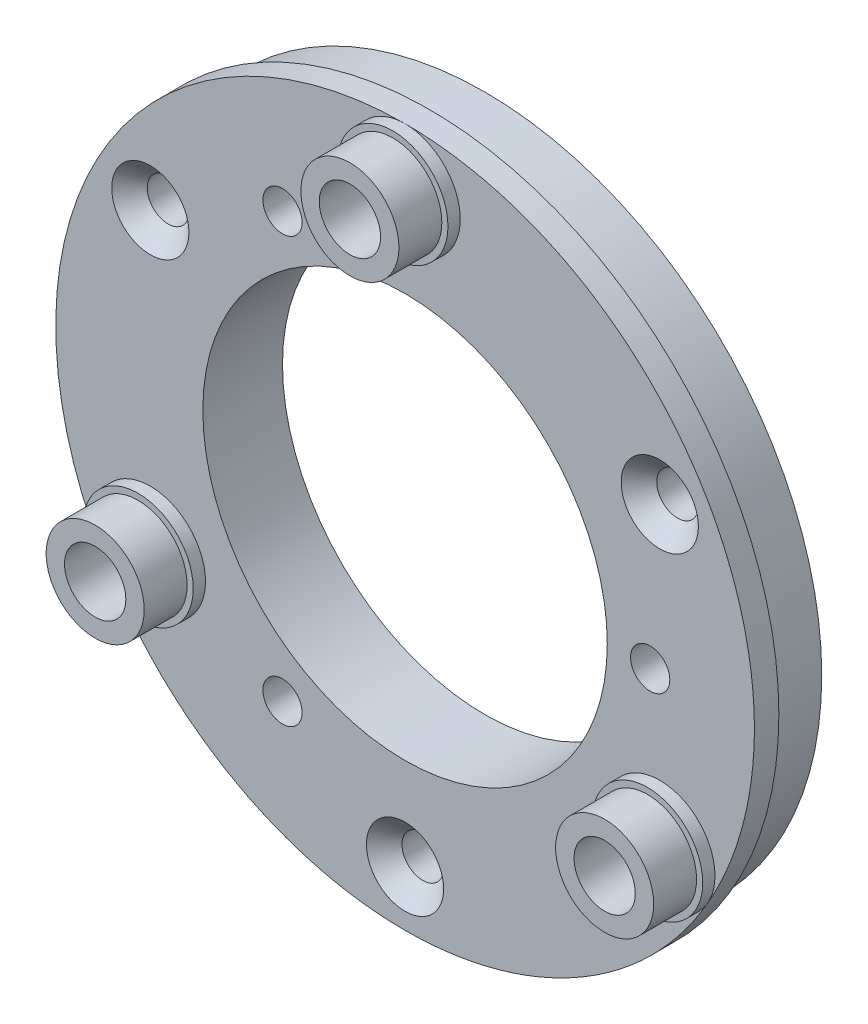
ISO-10303-21;
HEADER;
FILE_DESCRIPTION(('STEP AP214'),'2;1');
FILE_NAME('part.step','',(''),(''),'','','');
FILE_SCHEMA(('AUTOMOTIVE_DESIGN { 1 0 10303 214 1 1 1 1 }'));
ENDSEC;
DATA;
#1=APPLICATION_CONTEXT('core data for automotive mechanical design processes');
#2=APPLICATION_PROTOCOL_DEFINITION('international standard','automotive_design',2000,#1);
#3=PRODUCT_CONTEXT('',#1,'mechanical');
#4=PRODUCT('Part','Part','',(#3));
#5=PRODUCT_RELATED_PRODUCT_CATEGORY('part','',(#4));
#6=PRODUCT_DEFINITION_FORMATION('','',#4);
#7=PRODUCT_DEFINITION_CONTEXT('part definition',#1,'design');
#8=PRODUCT_DEFINITION('design','',#6,#7);
#9=PRODUCT_DEFINITION_SHAPE('','',#8);
#10=(LENGTH_UNIT() NAMED_UNIT(*) SI_UNIT(.MILLI.,.METRE.));
#11=(NAMED_UNIT(*) PLANE_ANGLE_UNIT() SI_UNIT($,.RADIAN.));
#12=(NAMED_UNIT(*) SI_UNIT($,.STERADIAN.) SOLID_ANGLE_UNIT());
#13=UNCERTAINTY_MEASURE_WITH_UNIT(LENGTH_MEASURE(1.E-05),#10,'distance_accuracy_value','');
#14=(GEOMETRIC_REPRESENTATION_CONTEXT(3) GLOBAL_UNCERTAINTY_ASSIGNED_CONTEXT((#13)) GLOBAL_UNIT_ASSIGNED_CONTEXT((#10,
#11,#12)) REPRESENTATION_CONTEXT('',''));
#15=CARTESIAN_POINT('',(0.,0.,0.));
#16=DIRECTION('',(0.,0.,1.));
#17=DIRECTION('',(1.,0.,0.));
#18=AXIS2_PLACEMENT_3D('',#15,#16,#17);
#19=CARTESIAN_POINT('',(0.,0.,-4.5));
#20=DIRECTION('',(0.,0.,-1.));
#21=DIRECTION('',(-1.,0.,0.));
#22=AXIS2_PLACEMENT_3D('',#19,#20,#21);
#23=PLANE('',#22);
#24=CARTESIAN_POINT('',(-1.75207071073658E-13,-24.,-4.5));
#25=DIRECTION('',(0.,0.,1.));
#26=DIRECTION('',(1.,0.,0.));
#27=AXIS2_PLACEMENT_3D('',#24,#25,#26);
#28=CIRCLE('',#27,1.7);
#29=CARTESIAN_POINT('',(1.69999999999982,-24.,-4.5));
#30=VERTEX_POINT('',#29);
#31=EDGE_CURVE('E575',#30,#30,#28,.T.);
#32=ORIENTED_EDGE('',*,*,#31,.T.);
#33=EDGE_LOOP('',(#32));
#34=FACE_BOUND('',#33,.T.);
#35=CARTESIAN_POINT('',(20.,-2.18575157973078E-13,-4.5));
#36=DIRECTION('',(0.,0.,-1.));
#37=DIRECTION('',(0.500000000000004,0.866025403784436,0.));
#38=AXIS2_PLACEMENT_3D('',#35,#36,#37);
#39=CIRCLE('',#38,1.6);
#40=CARTESIAN_POINT('',(20.8,1.38564064605488,-4.5));
#41=VERTEX_POINT('',#40);
#42=EDGE_CURVE('E578',#41,#41,#39,.T.);
#43=ORIENTED_EDGE('',*,*,#42,.F.);
#44=EDGE_LOOP('',(#43));
#45=FACE_BOUND('',#44,.T.);
#46=CARTESIAN_POINT('',(-10.0000000000003,-17.3205080756886,-4.5));
#47=DIRECTION('',(0.,0.,-1.));
#48=DIRECTION('',(0.499999999999992,-0.866025403784443,0.));
#49=AXIS2_PLACEMENT_3D('',#46,#47,#48);
#50=CIRCLE('',#49,1.6);
#51=CARTESIAN_POINT('',(-9.20000000000028,-18.7061487217437,-4.5));
#52=VERTEX_POINT('',#51);
#53=EDGE_CURVE('E577',#52,#52,#50,.T.);
#54=ORIENTED_EDGE('',*,*,#53,.F.);
#55=EDGE_LOOP('',(#54));
#56=FACE_BOUND('',#55,.T.);
#57=CARTESIAN_POINT('',(-9.99999999999989,17.3205080756888,-4.5));
#58=DIRECTION('',(0.,0.,-1.));
#59=DIRECTION('',(-1.,0.,0.));
#60=AXIS2_PLACEMENT_3D('',#57,#58,#59);
#61=CIRCLE('',#60,1.6);
#62=CARTESIAN_POINT('',(-11.5999999999999,17.3205080756888,-4.5));
#63=VERTEX_POINT('',#62);
#64=EDGE_CURVE('E589',#63,#63,#61,.T.);
#65=ORIENTED_EDGE('',*,*,#64,.F.);
#66=EDGE_LOOP('',(#65));
#67=FACE_BOUND('',#66,.T.);
#68=CARTESIAN_POINT('',(-20.7846096908265,-12.0000000000001,-4.5));
#69=DIRECTION('',(0.,0.,1.));
#70=DIRECTION('',(-0.500000000000004,0.866025403784436,0.));
#71=AXIS2_PLACEMENT_3D('',#68,#69,#70);
#72=CIRCLE('',#71,1.5);
#73=CARTESIAN_POINT('',(-21.5346096908265,-10.7009618943234,-4.5));
#74=VERTEX_POINT('',#73);
#75=EDGE_CURVE('E112',#74,#74,#72,.T.);
#76=ORIENTED_EDGE('',*,*,#75,.T.);
#77=EDGE_LOOP('',(#76));
#78=FACE_BOUND('',#77,.T.);
#79=CARTESIAN_POINT('',(20.7846096908266,-11.9999999999998,-4.5));
#80=DIRECTION('',(0.,0.,1.));
#81=DIRECTION('',(-0.499999999999992,-0.866025403784443,0.));
#82=AXIS2_PLACEMENT_3D('',#79,#80,#81);
#83=CIRCLE('',#82,1.5);
#84=CARTESIAN_POINT('',(20.0346096908267,-13.2990381056765,-4.5));
#85=VERTEX_POINT('',#84);
#86=EDGE_CURVE('E91',#85,#85,#83,.T.);
#87=ORIENTED_EDGE('',*,*,#86,.T.);
#88=EDGE_LOOP('',(#87));
#89=FACE_BOUND('',#88,.T.);
#90=CARTESIAN_POINT('',(0.,24.,-4.5));
#91=DIRECTION('',(0.,0.,1.));
#92=DIRECTION('',(1.,0.,0.));
#93=AXIS2_PLACEMENT_3D('',#90,#91,#92);
#94=CIRCLE('',#93,1.5);
#95=CARTESIAN_POINT('',(1.5,24.,-4.5));
#96=VERTEX_POINT('',#95);
#97=EDGE_CURVE('E115',#96,#96,#94,.T.);
#98=ORIENTED_EDGE('',*,*,#97,.T.);
#99=EDGE_LOOP('',(#98));
#100=FACE_BOUND('',#99,.T.);
#101=CARTESIAN_POINT('',(0.,0.,-4.5));
#102=DIRECTION('',(0.,0.,-1.));
#103=DIRECTION('',(-1.,0.,0.));
#104=AXIS2_PLACEMENT_3D('',#101,#102,#103);
#105=CIRCLE('',#104,27.5);
#106=CARTESIAN_POINT('',(-27.5,0.,-4.5));
#107=VERTEX_POINT('',#106);
#108=EDGE_CURVE('E81',#107,#107,#105,.T.);
#109=ORIENTED_EDGE('',*,*,#108,.T.);
#110=EDGE_LOOP('',(#109));
#111=FACE_BOUND('',#110,.T.);
#112=CARTESIAN_POINT('',(0.,0.,-4.5));
#113=DIRECTION('',(0.,0.,-1.));
#114=DIRECTION('',(-1.,0.,0.));
#115=AXIS2_PLACEMENT_3D('',#112,#113,#114);
#116=CIRCLE('',#115,16.5);
#117=CARTESIAN_POINT('',(-16.5,0.,-4.5));
#118=VERTEX_POINT('',#117);
#119=EDGE_CURVE('E594',#118,#118,#116,.T.);
#120=ORIENTED_EDGE('',*,*,#119,.F.);
#121=EDGE_LOOP('',(#120));
#122=FACE_BOUND('',#121,.T.);
#123=CARTESIAN_POINT('',(20.7846096908266,11.9999999999999,-4.5));
#124=DIRECTION('',(0.,0.,1.));
#125=DIRECTION('',(1.,0.,0.));
#126=AXIS2_PLACEMENT_3D('',#123,#124,#125);
#127=CIRCLE('',#126,1.7);
#128=CARTESIAN_POINT('',(22.4846096908266,11.9999999999999,-4.5));
#129=VERTEX_POINT('',#128);
#130=EDGE_CURVE('E566',#129,#129,#127,.T.);
#131=ORIENTED_EDGE('',*,*,#130,.T.);
#132=EDGE_LOOP('',(#131));
#133=FACE_BOUND('',#132,.T.);
#134=CARTESIAN_POINT('',(-20.7846096908264,12.0000000000003,-4.5));
#135=DIRECTION('',(0.,0.,1.));
#136=DIRECTION('',(1.,0.,0.));
#137=AXIS2_PLACEMENT_3D('',#134,#135,#136);
#138=CIRCLE('',#137,1.7);
#139=CARTESIAN_POINT('',(-19.0846096908264,12.0000000000003,-4.5));
#140=VERTEX_POINT('',#139);
#141=EDGE_CURVE('E555',#140,#140,#138,.T.);
#142=ORIENTED_EDGE('',*,*,#141,.T.);
#143=EDGE_LOOP('',(#142));
#144=FACE_BOUND('',#143,.T.);
#145=ADVANCED_FACE('F36',(#34,#45,#56,#67,#78,#89,#100,#111,#122,#133,#144),#23,.T.);
#146=CARTESIAN_POINT('',(-20.7846096908265,-12.0000000000001,0.));
#147=DIRECTION('',(0.,0.,1.));
#148=DIRECTION('',(1.,0.,0.));
#149=AXIS2_PLACEMENT_3D('',#146,#147,#148);
#150=CYLINDRICAL_SURFACE('',#149,1.5);
#151=ORIENTED_EDGE('',*,*,#75,.F.);
#152=EDGE_LOOP('',(#151));
#153=FACE_BOUND('',#152,.T.);
#154=CARTESIAN_POINT('',(-20.7846096908265,-12.0000000000001,-1.5));
#155=DIRECTION('',(0.,0.,1.));
#156=DIRECTION('',(1.,0.,0.));
#157=AXIS2_PLACEMENT_3D('',#154,#155,#156);
#158=CIRCLE('',#157,1.5);
#159=CARTESIAN_POINT('',(-19.2846096908265,-12.0000000000001,-1.5));
#160=VERTEX_POINT('',#159);
#161=EDGE_CURVE('E40',#160,#160,#158,.F.);
#162=ORIENTED_EDGE('',*,*,#161,.F.);
#163=EDGE_LOOP('',(#162));
#164=FACE_BOUND('',#163,.T.);
#165=ADVANCED_FACE('F169',(#153,#164),#150,.F.);
#166=CARTESIAN_POINT('',(20.7846096908266,-11.9999999999998,0.));
#167=DIRECTION('',(0.,0.,1.));
#168=DIRECTION('',(1.,0.,0.));
#169=AXIS2_PLACEMENT_3D('',#166,#167,#168);
#170=CYLINDRICAL_SURFACE('',#169,1.5);
#171=ORIENTED_EDGE('',*,*,#86,.F.);
#172=EDGE_LOOP('',(#171));
#173=FACE_BOUND('',#172,.T.);
#174=CARTESIAN_POINT('',(20.7846096908266,-11.9999999999998,-1.5));
#175=DIRECTION('',(0.,0.,1.));
#176=DIRECTION('',(1.,0.,0.));
#177=AXIS2_PLACEMENT_3D('',#174,#175,#176);
#178=CIRCLE('',#177,1.5);
#179=CARTESIAN_POINT('',(22.2846096908266,-11.9999999999998,-1.5));
#180=VERTEX_POINT('',#179);
#181=EDGE_CURVE('E93',#180,#180,#178,.F.);
#182=ORIENTED_EDGE('',*,*,#181,.F.);
#183=EDGE_LOOP('',(#182));
#184=FACE_BOUND('',#183,.T.);
#185=ADVANCED_FACE('F174',(#173,#184),#170,.F.);
#186=CARTESIAN_POINT('',(0.,24.,0.));
#187=DIRECTION('',(0.,0.,1.));
#188=DIRECTION('',(1.,0.,0.));
#189=AXIS2_PLACEMENT_3D('',#186,#187,#188);
#190=CYLINDRICAL_SURFACE('',#189,1.5);
#191=ORIENTED_EDGE('',*,*,#97,.F.);
#192=EDGE_LOOP('',(#191));
#193=FACE_BOUND('',#192,.T.);
#194=CARTESIAN_POINT('',(0.,24.,-1.5));
#195=DIRECTION('',(0.,0.,1.));
#196=DIRECTION('',(1.,0.,0.));
#197=AXIS2_PLACEMENT_3D('',#194,#195,#196);
#198=CIRCLE('',#197,1.5);
#199=CARTESIAN_POINT('',(1.5,24.,-1.5));
#200=VERTEX_POINT('',#199);
#201=EDGE_CURVE('E89',#200,#200,#198,.F.);
#202=ORIENTED_EDGE('',*,*,#201,.F.);
#203=EDGE_LOOP('',(#202));
#204=FACE_BOUND('',#203,.T.);
#205=ADVANCED_FACE('F185',(#193,#204),#190,.F.);
#206=CARTESIAN_POINT('',(0.,0.,2.));
#207=DIRECTION('',(0.,0.,1.));
#208=DIRECTION('',(1.,0.,0.));
#209=AXIS2_PLACEMENT_3D('',#206,#207,#208);
#210=PLANE('',#209);
#211=CARTESIAN_POINT('',(-20.7846096908264,12.0000000000003,2.));
#212=DIRECTION('',(0.,0.,1.));
#213=DIRECTION('',(1.,0.,0.));
#214=AXIS2_PLACEMENT_3D('',#211,#212,#213);
#215=CIRCLE('',#214,3.15);
#216=CARTESIAN_POINT('',(-17.6346096908264,12.0000000000003,2.));
#217=VERTEX_POINT('',#216);
#218=EDGE_CURVE('E553',#217,#217,#215,.T.);
#219=ORIENTED_EDGE('',*,*,#218,.F.);
#220=EDGE_LOOP('',(#219));
#221=FACE_BOUND('',#220,.T.);
#222=CARTESIAN_POINT('',(20.7846096908266,11.9999999999999,2.));
#223=DIRECTION('',(0.,0.,1.));
#224=DIRECTION('',(1.,0.,0.));
#225=AXIS2_PLACEMENT_3D('',#222,#223,#224);
#226=CIRCLE('',#225,3.15);
#227=CARTESIAN_POINT('',(23.9346096908266,11.9999999999999,2.));
#228=VERTEX_POINT('',#227);
#229=EDGE_CURVE('E560',#228,#228,#226,.T.);
#230=ORIENTED_EDGE('',*,*,#229,.F.);
#231=EDGE_LOOP('',(#230));
#232=FACE_BOUND('',#231,.T.);
#233=CARTESIAN_POINT('',(-1.75207071073658E-13,-24.,2.));
#234=DIRECTION('',(0.,0.,1.));
#235=DIRECTION('',(1.,0.,0.));
#236=AXIS2_PLACEMENT_3D('',#233,#234,#235);
#237=CIRCLE('',#236,3.15);
#238=CARTESIAN_POINT('',(3.14999999999982,-24.,2.));
#239=VERTEX_POINT('',#238);
#240=EDGE_CURVE('E569',#239,#239,#237,.T.);
#241=ORIENTED_EDGE('',*,*,#240,.F.);
#242=EDGE_LOOP('',(#241));
#243=FACE_BOUND('',#242,.T.);
#244=CARTESIAN_POINT('',(20.,-2.18575157973078E-13,2.));
#245=DIRECTION('',(0.,0.,1.));
#246=DIRECTION('',(1.,0.,0.));
#247=AXIS2_PLACEMENT_3D('',#244,#245,#246);
#248=CIRCLE('',#247,1.6);
#249=CARTESIAN_POINT('',(21.6,-2.18575157973078E-13,2.));
#250=VERTEX_POINT('',#249);
#251=EDGE_CURVE('E586',#250,#250,#248,.T.);
#252=ORIENTED_EDGE('',*,*,#251,.F.);
#253=EDGE_LOOP('',(#252));
#254=FACE_BOUND('',#253,.T.);
#255=CARTESIAN_POINT('',(-10.0000000000003,-17.3205080756886,2.));
#256=DIRECTION('',(0.,0.,1.));
#257=DIRECTION('',(1.,0.,0.));
#258=AXIS2_PLACEMENT_3D('',#255,#256,#257);
#259=CIRCLE('',#258,1.6);
#260=CARTESIAN_POINT('',(-8.40000000000027,-17.3205080756886,2.));
#261=VERTEX_POINT('',#260);
#262=EDGE_CURVE('E581',#261,#261,#259,.T.);
#263=ORIENTED_EDGE('',*,*,#262,.F.);
#264=EDGE_LOOP('',(#263));
#265=FACE_BOUND('',#264,.T.);
#266=CARTESIAN_POINT('',(-9.99999999999989,17.3205080756888,2.));
#267=DIRECTION('',(0.,0.,1.));
#268=DIRECTION('',(1.,0.,0.));
#269=AXIS2_PLACEMENT_3D('',#266,#267,#268);
#270=CIRCLE('',#269,1.6);
#271=CARTESIAN_POINT('',(-8.39999999999989,17.3205080756888,2.));
#272=VERTEX_POINT('',#271);
#273=EDGE_CURVE('E592',#272,#272,#270,.T.);
#274=ORIENTED_EDGE('',*,*,#273,.F.);
#275=EDGE_LOOP('',(#274));
#276=FACE_BOUND('',#275,.T.);
#277=CARTESIAN_POINT('',(0.,24.,2.));
#278=DIRECTION('',(0.,0.,1.));
#279=DIRECTION('',(1.,0.,0.));
#280=AXIS2_PLACEMENT_3D('',#277,#278,#279);
#281=CIRCLE('',#280,4.5);
#282=CARTESIAN_POINT('',(0.,28.5,2.));
#283=VERTEX_POINT('',#282);
#284=EDGE_CURVE('E63',#283,#283,#281,.T.);
#285=ORIENTED_EDGE('',*,*,#284,.F.);
#286=CARTESIAN_POINT('',(0.,0.,2.));
#287=DIRECTION('',(0.,0.,1.));
#288=DIRECTION('',(1.,0.,0.));
#289=AXIS2_PLACEMENT_3D('',#286,#287,#288);
#290=CIRCLE('',#289,28.5);
#291=CARTESIAN_POINT('',(-24.6817240078564,-14.2500000000001,2.));
#292=VERTEX_POINT('',#291);
#293=EDGE_CURVE('E67',#283,#292,#290,.T.);
#294=ORIENTED_EDGE('',*,*,#293,.T.);
#295=CARTESIAN_POINT('',(-20.7846096908265,-12.0000000000001,2.));
#296=DIRECTION('',(0.,0.,1.));
#297=DIRECTION('',(-0.500000000000004,0.866025403784436,0.));
#298=AXIS2_PLACEMENT_3D('',#295,#296,#297);
#299=CIRCLE('',#298,4.5);
#300=EDGE_CURVE('E56',#292,#292,#299,.T.);
#301=ORIENTED_EDGE('',*,*,#300,.F.);
#302=CARTESIAN_POINT('',(24.6817240078566,-14.2499999999998,2.));
#303=VERTEX_POINT('',#302);
#304=EDGE_CURVE('E86',#292,#303,#290,.T.);
#305=ORIENTED_EDGE('',*,*,#304,.T.);
#306=CARTESIAN_POINT('',(20.7846096908266,-11.9999999999998,2.));
#307=DIRECTION('',(0.,0.,1.));
#308=DIRECTION('',(-0.499999999999992,-0.866025403784443,0.));
#309=AXIS2_PLACEMENT_3D('',#306,#307,#308);
#310=CIRCLE('',#309,4.5);
#311=EDGE_CURVE('E51',#303,#303,#310,.T.);
#312=ORIENTED_EDGE('',*,*,#311,.F.);
#313=EDGE_CURVE('E69',#303,#283,#290,.T.);
#314=ORIENTED_EDGE('',*,*,#313,.T.);
#315=EDGE_LOOP('',(#285,#294,#301,#305,#312,#314));
#316=FACE_BOUND('',#315,.T.);
#317=CARTESIAN_POINT('',(0.,0.,2.));
#318=DIRECTION('',(0.,0.,1.));
#319=DIRECTION('',(1.,0.,0.));
#320=AXIS2_PLACEMENT_3D('',#317,#318,#319);
#321=CIRCLE('',#320,16.5);
#322=CARTESIAN_POINT('',(16.5,0.,2.));
#323=VERTEX_POINT('',#322);
#324=EDGE_CURVE('E105',#323,#323,#321,.F.);
#325=ORIENTED_EDGE('',*,*,#324,.T.);
#326=EDGE_LOOP('',(#325));
#327=FACE_BOUND('',#326,.T.);
#328=ADVANCED_FACE('F64',(#221,#232,#243,#254,#265,#276,#316,#327),#210,.T.);
#329=CARTESIAN_POINT('',(0.,0.,0.));
#330=DIRECTION('',(0.,0.,1.));
#331=DIRECTION('',(1.,0.,0.));
#332=AXIS2_PLACEMENT_3D('',#329,#330,#331);
#333=PLANE('',#332);
#334=CARTESIAN_POINT('',(0.,0.,0.));
#335=DIRECTION('',(0.,0.,-1.));
#336=DIRECTION('',(-1.,0.,0.));
#337=AXIS2_PLACEMENT_3D('',#334,#335,#336);
#338=CIRCLE('',#337,27.5);
#339=CARTESIAN_POINT('',(-27.5,0.,0.));
#340=VERTEX_POINT('',#339);
#341=EDGE_CURVE('E72',#340,#340,#338,.T.);
#342=ORIENTED_EDGE('',*,*,#341,.F.);
#343=EDGE_LOOP('',(#342));
#344=FACE_BOUND('',#343,.T.);
#345=CARTESIAN_POINT('',(0.,0.,0.));
#346=DIRECTION('',(0.,0.,1.));
#347=DIRECTION('',(1.,0.,0.));
#348=AXIS2_PLACEMENT_3D('',#345,#346,#347);
#349=CIRCLE('',#348,28.5);
#350=CARTESIAN_POINT('',(28.5,0.,0.));
#351=VERTEX_POINT('',#350);
#352=EDGE_CURVE('E83',#351,#351,#349,.T.);
#353=ORIENTED_EDGE('',*,*,#352,.F.);
#354=EDGE_LOOP('',(#353));
#355=FACE_BOUND('',#354,.T.);
#356=ADVANCED_FACE('F191',(#344,#355),#333,.F.);
#357=CARTESIAN_POINT('',(0.,0.,2.));
#358=DIRECTION('',(0.,0.,-1.));
#359=DIRECTION('',(-1.,0.,0.));
#360=AXIS2_PLACEMENT_3D('',#357,#358,#359);
#361=CYLINDRICAL_SURFACE('',#360,28.5);
#362=ORIENTED_EDGE('',*,*,#293,.F.);
#363=ORIENTED_EDGE('',*,*,#313,.F.);
#364=ORIENTED_EDGE('',*,*,#304,.F.);
#365=EDGE_LOOP('',(#362,#363,#364));
#366=FACE_BOUND('',#365,.T.);
#367=ORIENTED_EDGE('',*,*,#352,.T.);
#368=EDGE_LOOP('',(#367));
#369=FACE_BOUND('',#368,.T.);
#370=ADVANCED_FACE('F38',(#366,#369),#361,.T.);
#371=CARTESIAN_POINT('',(0.,0.,-4.5));
#372=DIRECTION('',(0.,0.,1.));
#373=DIRECTION('',(1.,0.,0.));
#374=AXIS2_PLACEMENT_3D('',#371,#372,#373);
#375=CYLINDRICAL_SURFACE('',#374,27.5);
#376=ORIENTED_EDGE('',*,*,#108,.F.);
#377=EDGE_LOOP('',(#376));
#378=FACE_BOUND('',#377,.T.);
#379=ORIENTED_EDGE('',*,*,#341,.T.);
#380=EDGE_LOOP('',(#379));
#381=FACE_BOUND('',#380,.T.);
#382=ADVANCED_FACE('F164',(#378,#381),#375,.T.);
#383=CARTESIAN_POINT('',(0.,24.,3.));
#384=DIRECTION('',(0.,0.,1.));
#385=DIRECTION('',(1.,0.,0.));
#386=AXIS2_PLACEMENT_3D('',#383,#384,#385);
#387=PLANE('',#386);
#388=CARTESIAN_POINT('',(0.,24.,3.));
#389=DIRECTION('',(0.,0.,1.));
#390=DIRECTION('',(1.,0.,0.));
#391=AXIS2_PLACEMENT_3D('',#388,#389,#390);
#392=CIRCLE('',#391,4.);
#393=CARTESIAN_POINT('',(4.,24.,3.));
#394=VERTEX_POINT('',#393);
#395=EDGE_CURVE('E71',#394,#394,#392,.T.);
#396=ORIENTED_EDGE('',*,*,#395,.F.);
#397=EDGE_LOOP('',(#396));
#398=FACE_BOUND('',#397,.T.);
#399=CARTESIAN_POINT('',(0.,24.,3.));
#400=DIRECTION('',(0.,0.,1.));
#401=DIRECTION('',(1.,0.,0.));
#402=AXIS2_PLACEMENT_3D('',#399,#400,#401);
#403=CIRCLE('',#402,4.5);
#404=CARTESIAN_POINT('',(4.5,24.,3.));
#405=VERTEX_POINT('',#404);
#406=EDGE_CURVE('E80',#405,#405,#403,.T.);
#407=ORIENTED_EDGE('',*,*,#406,.T.);
#408=EDGE_LOOP('',(#407));
#409=FACE_BOUND('',#408,.T.);
#410=ADVANCED_FACE('F152',(#398,#409),#387,.T.);
#411=CARTESIAN_POINT('',(0.,24.,3.));
#412=DIRECTION('',(0.,0.,-1.));
#413=DIRECTION('',(-1.,0.,0.));
#414=AXIS2_PLACEMENT_3D('',#411,#412,#413);
#415=CYLINDRICAL_SURFACE('',#414,4.5);
#416=ORIENTED_EDGE('',*,*,#406,.F.);
#417=EDGE_LOOP('',(#416));
#418=FACE_BOUND('',#417,.T.);
#419=ORIENTED_EDGE('',*,*,#284,.T.);
#420=EDGE_LOOP('',(#419));
#421=FACE_BOUND('',#420,.T.);
#422=ADVANCED_FACE('F154',(#418,#421),#415,.T.);
#423=CARTESIAN_POINT('',(0.,24.,6.5));
#424=DIRECTION('',(0.,0.,1.));
#425=DIRECTION('',(1.,0.,0.));
#426=AXIS2_PLACEMENT_3D('',#423,#424,#425);
#427=PLANE('',#426);
#428=CARTESIAN_POINT('',(0.,24.,6.5));
#429=DIRECTION('',(0.,0.,1.));
#430=DIRECTION('',(1.,0.,0.));
#431=AXIS2_PLACEMENT_3D('',#428,#429,#430);
#432=CIRCLE('',#431,4.);
#433=CARTESIAN_POINT('',(4.,24.,6.5));
#434=VERTEX_POINT('',#433);
#435=EDGE_CURVE('E145',#434,#434,#432,.T.);
#436=ORIENTED_EDGE('',*,*,#435,.T.);
#437=EDGE_LOOP('',(#436));
#438=FACE_BOUND('',#437,.T.);
#439=CARTESIAN_POINT('',(0.,24.,6.5));
#440=DIRECTION('',(0.,0.,1.));
#441=DIRECTION('',(1.,0.,0.));
#442=AXIS2_PLACEMENT_3D('',#439,#440,#441);
#443=CIRCLE('',#442,2.5);
#444=CARTESIAN_POINT('',(2.5,24.,6.5));
#445=VERTEX_POINT('',#444);
#446=EDGE_CURVE('E141',#445,#445,#443,.T.);
#447=ORIENTED_EDGE('',*,*,#446,.F.);
#448=EDGE_LOOP('',(#447));
#449=FACE_BOUND('',#448,.T.);
#450=ADVANCED_FACE('F156',(#438,#449),#427,.T.);
#451=CARTESIAN_POINT('',(0.,24.,6.5));
#452=DIRECTION('',(0.,0.,-1.));
#453=DIRECTION('',(-1.,0.,0.));
#454=AXIS2_PLACEMENT_3D('',#451,#452,#453);
#455=CYLINDRICAL_SURFACE('',#454,4.);
#456=ORIENTED_EDGE('',*,*,#435,.F.);
#457=EDGE_LOOP('',(#456));
#458=FACE_BOUND('',#457,.T.);
#459=ORIENTED_EDGE('',*,*,#395,.T.);
#460=EDGE_LOOP('',(#459));
#461=FACE_BOUND('',#460,.T.);
#462=ADVANCED_FACE('F162',(#458,#461),#455,.T.);
#463=CARTESIAN_POINT('',(0.,24.,3.));
#464=DIRECTION('',(0.,0.,-1.));
#465=DIRECTION('',(-1.,0.,0.));
#466=AXIS2_PLACEMENT_3D('',#463,#464,#465);
#467=CYLINDRICAL_SURFACE('',#466,2.5);
#468=ORIENTED_EDGE('',*,*,#446,.T.);
#469=EDGE_LOOP('',(#468));
#470=FACE_BOUND('',#469,.T.);
#471=CARTESIAN_POINT('',(0.,24.,-1.5));
#472=DIRECTION('',(0.,0.,1.));
#473=DIRECTION('',(1.,0.,0.));
#474=AXIS2_PLACEMENT_3D('',#471,#472,#473);
#475=CIRCLE('',#474,2.5);
#476=CARTESIAN_POINT('',(2.5,24.,-1.5));
#477=VERTEX_POINT('',#476);
#478=EDGE_CURVE('E92',#477,#477,#475,.T.);
#479=ORIENTED_EDGE('',*,*,#478,.F.);
#480=EDGE_LOOP('',(#479));
#481=FACE_BOUND('',#480,.T.);
#482=ADVANCED_FACE('F233',(#470,#481),#467,.F.);
#483=CARTESIAN_POINT('',(-20.7846096908265,-12.0000000000001,3.));
#484=DIRECTION('',(0.,0.,1.));
#485=DIRECTION('',(-0.500000000000004,0.866025403784436,0.));
#486=AXIS2_PLACEMENT_3D('',#483,#484,#485);
#487=PLANE('',#486);
#488=CARTESIAN_POINT('',(-20.7846096908265,-12.0000000000001,3.));
#489=DIRECTION('',(0.,0.,1.));
#490=DIRECTION('',(-0.500000000000004,0.866025403784436,0.));
#491=AXIS2_PLACEMENT_3D('',#488,#489,#490);
#492=CIRCLE('',#491,4.);
#493=CARTESIAN_POINT('',(-22.7846096908265,-8.53589838486235,3.));
#494=VERTEX_POINT('',#493);
#495=EDGE_CURVE('E45',#494,#494,#492,.T.);
#496=ORIENTED_EDGE('',*,*,#495,.F.);
#497=EDGE_LOOP('',(#496));
#498=FACE_BOUND('',#497,.T.);
#499=CARTESIAN_POINT('',(-20.7846096908265,-12.0000000000001,3.));
#500=DIRECTION('',(0.,0.,1.));
#501=DIRECTION('',(-0.500000000000004,0.866025403784436,0.));
#502=AXIS2_PLACEMENT_3D('',#499,#500,#501);
#503=CIRCLE('',#502,4.5);
#504=CARTESIAN_POINT('',(-23.0346096908265,-8.10288568297014,3.));
#505=VERTEX_POINT('',#504);
#506=EDGE_CURVE('E138',#505,#505,#503,.T.);
#507=ORIENTED_EDGE('',*,*,#506,.T.);
#508=EDGE_LOOP('',(#507));
#509=FACE_BOUND('',#508,.T.);
#510=ADVANCED_FACE('F244',(#498,#509),#487,.T.);
#511=CARTESIAN_POINT('',(-20.7846096908265,-12.0000000000001,3.));
#512=DIRECTION('',(0.,0.,-1.));
#513=DIRECTION('',(-1.,0.,0.));
#514=AXIS2_PLACEMENT_3D('',#511,#512,#513);
#515=CYLINDRICAL_SURFACE('',#514,4.5);
#516=ORIENTED_EDGE('',*,*,#506,.F.);
#517=EDGE_LOOP('',(#516));
#518=FACE_BOUND('',#517,.T.);
#519=ORIENTED_EDGE('',*,*,#300,.T.);
#520=EDGE_LOOP('',(#519));
#521=FACE_BOUND('',#520,.T.);
#522=ADVANCED_FACE('F253',(#518,#521),#515,.T.);
#523=CARTESIAN_POINT('',(20.7846096908266,-11.9999999999998,3.));
#524=DIRECTION('',(0.,0.,1.));
#525=DIRECTION('',(-0.499999999999992,-0.866025403784443,0.));
#526=AXIS2_PLACEMENT_3D('',#523,#524,#525);
#527=PLANE('',#526);
#528=CARTESIAN_POINT('',(20.7846096908266,-11.9999999999998,3.));
#529=DIRECTION('',(0.,0.,1.));
#530=DIRECTION('',(-0.499999999999992,-0.866025403784443,0.));
#531=AXIS2_PLACEMENT_3D('',#528,#529,#530);
#532=CIRCLE('',#531,4.);
#533=CARTESIAN_POINT('',(18.7846096908267,-15.4641016151376,3.));
#534=VERTEX_POINT('',#533);
#535=EDGE_CURVE('E11',#534,#534,#532,.T.);
#536=ORIENTED_EDGE('',*,*,#535,.F.);
#537=EDGE_LOOP('',(#536));
#538=FACE_BOUND('',#537,.T.);
#539=CARTESIAN_POINT('',(20.7846096908266,-11.9999999999998,3.));
#540=DIRECTION('',(0.,0.,1.));
#541=DIRECTION('',(-0.499999999999992,-0.866025403784443,0.));
#542=AXIS2_PLACEMENT_3D('',#539,#540,#541);
#543=CIRCLE('',#542,4.5);
#544=CARTESIAN_POINT('',(18.5346096908267,-15.8971143170298,3.));
#545=VERTEX_POINT('',#544);
#546=EDGE_CURVE('E134',#545,#545,#543,.T.);
#547=ORIENTED_EDGE('',*,*,#546,.T.);
#548=EDGE_LOOP('',(#547));
#549=FACE_BOUND('',#548,.T.);
#550=ADVANCED_FACE('F262',(#538,#549),#527,.T.);
#551=CARTESIAN_POINT('',(20.7846096908266,-11.9999999999998,3.));
#552=DIRECTION('',(0.,0.,-1.));
#553=DIRECTION('',(-1.,0.,0.));
#554=AXIS2_PLACEMENT_3D('',#551,#552,#553);
#555=CYLINDRICAL_SURFACE('',#554,4.5);
#556=ORIENTED_EDGE('',*,*,#546,.F.);
#557=EDGE_LOOP('',(#556));
#558=FACE_BOUND('',#557,.T.);
#559=ORIENTED_EDGE('',*,*,#311,.T.);
#560=EDGE_LOOP('',(#559));
#561=FACE_BOUND('',#560,.T.);
#562=ADVANCED_FACE('F270',(#558,#561),#555,.T.);
#563=CARTESIAN_POINT('',(-20.7846096908265,-12.0000000000001,6.5));
#564=DIRECTION('',(0.,0.,1.));
#565=DIRECTION('',(-0.500000000000004,0.866025403784436,0.));
#566=AXIS2_PLACEMENT_3D('',#563,#564,#565);
#567=PLANE('',#566);
#568=CARTESIAN_POINT('',(-20.7846096908265,-12.0000000000001,6.5));
#569=DIRECTION('',(0.,0.,1.));
#570=DIRECTION('',(-0.500000000000004,0.866025403784436,0.));
#571=AXIS2_PLACEMENT_3D('',#568,#569,#570);
#572=CIRCLE('',#571,4.);
#573=CARTESIAN_POINT('',(-22.7846096908265,-8.53589838486235,6.5));
#574=VERTEX_POINT('',#573);
#575=EDGE_CURVE('E129',#574,#574,#572,.T.);
#576=ORIENTED_EDGE('',*,*,#575,.T.);
#577=EDGE_LOOP('',(#576));
#578=FACE_BOUND('',#577,.T.);
#579=CARTESIAN_POINT('',(-20.7846096908265,-12.0000000000001,6.5));
#580=DIRECTION('',(0.,0.,1.));
#581=DIRECTION('',(-0.500000000000004,0.866025403784436,0.));
#582=AXIS2_PLACEMENT_3D('',#579,#580,#581);
#583=CIRCLE('',#582,2.5);
#584=CARTESIAN_POINT('',(-22.0346096908265,-9.83493649053901,6.5));
#585=VERTEX_POINT('',#584);
#586=EDGE_CURVE('E125',#585,#585,#583,.T.);
#587=ORIENTED_EDGE('',*,*,#586,.F.);
#588=EDGE_LOOP('',(#587));
#589=FACE_BOUND('',#588,.T.);
#590=ADVANCED_FACE('F278',(#578,#589),#567,.T.);
#591=CARTESIAN_POINT('',(-20.7846096908265,-12.0000000000001,6.5));
#592=DIRECTION('',(0.,0.,-1.));
#593=DIRECTION('',(-1.,0.,0.));
#594=AXIS2_PLACEMENT_3D('',#591,#592,#593);
#595=CYLINDRICAL_SURFACE('',#594,4.);
#596=ORIENTED_EDGE('',*,*,#575,.F.);
#597=EDGE_LOOP('',(#596));
#598=FACE_BOUND('',#597,.T.);
#599=ORIENTED_EDGE('',*,*,#495,.T.);
#600=EDGE_LOOP('',(#599));
#601=FACE_BOUND('',#600,.T.);
#602=ADVANCED_FACE('F286',(#598,#601),#595,.T.);
#603=CARTESIAN_POINT('',(-20.7846096908265,-12.0000000000001,3.));
#604=DIRECTION('',(0.,0.,-1.));
#605=DIRECTION('',(-1.,0.,0.));
#606=AXIS2_PLACEMENT_3D('',#603,#604,#605);
#607=CYLINDRICAL_SURFACE('',#606,2.5);
#608=ORIENTED_EDGE('',*,*,#586,.T.);
#609=EDGE_LOOP('',(#608));
#610=FACE_BOUND('',#609,.T.);
#611=CARTESIAN_POINT('',(-20.7846096908265,-12.0000000000001,-1.5));
#612=DIRECTION('',(0.,0.,1.));
#613=DIRECTION('',(-0.500000000000004,0.866025403784436,0.));
#614=AXIS2_PLACEMENT_3D('',#611,#612,#613);
#615=CIRCLE('',#614,2.5);
#616=CARTESIAN_POINT('',(-22.0346096908265,-9.83493649053901,-1.5));
#617=VERTEX_POINT('',#616);
#618=EDGE_CURVE('E95',#617,#617,#615,.T.);
#619=ORIENTED_EDGE('',*,*,#618,.F.);
#620=EDGE_LOOP('',(#619));
#621=FACE_BOUND('',#620,.T.);
#622=ADVANCED_FACE('F294',(#610,#621),#607,.F.);
#623=CARTESIAN_POINT('',(20.7846096908266,-11.9999999999998,6.5));
#624=DIRECTION('',(0.,0.,1.));
#625=DIRECTION('',(-0.499999999999992,-0.866025403784443,0.));
#626=AXIS2_PLACEMENT_3D('',#623,#624,#625);
#627=PLANE('',#626);
#628=CARTESIAN_POINT('',(20.7846096908266,-11.9999999999998,6.5));
#629=DIRECTION('',(0.,0.,1.));
#630=DIRECTION('',(-0.499999999999992,-0.866025403784443,0.));
#631=AXIS2_PLACEMENT_3D('',#628,#629,#630);
#632=CIRCLE('',#631,4.);
#633=CARTESIAN_POINT('',(18.7846096908267,-15.4641016151376,6.5));
#634=VERTEX_POINT('',#633);
#635=EDGE_CURVE('E123',#634,#634,#632,.T.);
#636=ORIENTED_EDGE('',*,*,#635,.T.);
#637=EDGE_LOOP('',(#636));
#638=FACE_BOUND('',#637,.T.);
#639=CARTESIAN_POINT('',(20.7846096908266,-11.9999999999998,6.5));
#640=DIRECTION('',(0.,0.,1.));
#641=DIRECTION('',(-0.499999999999992,-0.866025403784443,0.));
#642=AXIS2_PLACEMENT_3D('',#639,#640,#641);
#643=CIRCLE('',#642,2.5);
#644=CARTESIAN_POINT('',(19.5346096908267,-14.1650635094609,6.5));
#645=VERTEX_POINT('',#644);
#646=EDGE_CURVE('E120',#645,#645,#643,.T.);
#647=ORIENTED_EDGE('',*,*,#646,.F.);
#648=EDGE_LOOP('',(#647));
#649=FACE_BOUND('',#648,.T.);
#650=ADVANCED_FACE('F303',(#638,#649),#627,.T.);
#651=CARTESIAN_POINT('',(20.7846096908266,-11.9999999999998,6.5));
#652=DIRECTION('',(0.,0.,-1.));
#653=DIRECTION('',(-1.,0.,0.));
#654=AXIS2_PLACEMENT_3D('',#651,#652,#653);
#655=CYLINDRICAL_SURFACE('',#654,4.);
#656=ORIENTED_EDGE('',*,*,#635,.F.);
#657=EDGE_LOOP('',(#656));
#658=FACE_BOUND('',#657,.T.);
#659=ORIENTED_EDGE('',*,*,#535,.T.);
#660=EDGE_LOOP('',(#659));
#661=FACE_BOUND('',#660,.T.);
#662=ADVANCED_FACE('F312',(#658,#661),#655,.T.);
#663=CARTESIAN_POINT('',(20.7846096908266,-11.9999999999998,3.));
#664=DIRECTION('',(0.,0.,-1.));
#665=DIRECTION('',(-1.,0.,0.));
#666=AXIS2_PLACEMENT_3D('',#663,#664,#665);
#667=CYLINDRICAL_SURFACE('',#666,2.5);
#668=ORIENTED_EDGE('',*,*,#646,.T.);
#669=EDGE_LOOP('',(#668));
#670=FACE_BOUND('',#669,.T.);
#671=CARTESIAN_POINT('',(20.7846096908266,-11.9999999999998,-1.5));
#672=DIRECTION('',(0.,0.,1.));
#673=DIRECTION('',(-0.499999999999992,-0.866025403784443,0.));
#674=AXIS2_PLACEMENT_3D('',#671,#672,#673);
#675=CIRCLE('',#674,2.5);
#676=CARTESIAN_POINT('',(19.5346096908267,-14.1650635094609,-1.5));
#677=VERTEX_POINT('',#676);
#678=EDGE_CURVE('E100',#677,#677,#675,.T.);
#679=ORIENTED_EDGE('',*,*,#678,.F.);
#680=EDGE_LOOP('',(#679));
#681=FACE_BOUND('',#680,.T.);
#682=ADVANCED_FACE('F320',(#670,#681),#667,.F.);
#683=CARTESIAN_POINT('',(0.,24.,-1.5));
#684=DIRECTION('',(0.,0.,1.));
#685=DIRECTION('',(1.,0.,0.));
#686=AXIS2_PLACEMENT_3D('',#683,#684,#685);
#687=PLANE('',#686);
#688=ORIENTED_EDGE('',*,*,#478,.T.);
#689=EDGE_LOOP('',(#688));
#690=FACE_BOUND('',#689,.T.);
#691=ORIENTED_EDGE('',*,*,#201,.T.);
#692=EDGE_LOOP('',(#691));
#693=FACE_BOUND('',#692,.T.);
#694=ADVANCED_FACE('F327',(#690,#693),#687,.T.);
#695=CARTESIAN_POINT('',(20.7846096908266,-11.9999999999998,-1.5));
#696=DIRECTION('',(0.,0.,1.));
#697=DIRECTION('',(-0.499999999999992,-0.866025403784443,0.));
#698=AXIS2_PLACEMENT_3D('',#695,#696,#697);
#699=PLANE('',#698);
#700=ORIENTED_EDGE('',*,*,#678,.T.);
#701=EDGE_LOOP('',(#700));
#702=FACE_BOUND('',#701,.T.);
#703=ORIENTED_EDGE('',*,*,#181,.T.);
#704=EDGE_LOOP('',(#703));
#705=FACE_BOUND('',#704,.T.);
#706=ADVANCED_FACE('F335',(#702,#705),#699,.T.);
#707=CARTESIAN_POINT('',(-20.7846096908265,-12.0000000000001,-1.5));
#708=DIRECTION('',(0.,0.,1.));
#709=DIRECTION('',(-0.500000000000004,0.866025403784436,0.));
#710=AXIS2_PLACEMENT_3D('',#707,#708,#709);
#711=PLANE('',#710);
#712=ORIENTED_EDGE('',*,*,#618,.T.);
#713=EDGE_LOOP('',(#712));
#714=FACE_BOUND('',#713,.T.);
#715=ORIENTED_EDGE('',*,*,#161,.T.);
#716=EDGE_LOOP('',(#715));
#717=FACE_BOUND('',#716,.T.);
#718=ADVANCED_FACE('F343',(#714,#717),#711,.T.);
#719=CARTESIAN_POINT('',(0.,0.,57.1543289325507));
#720=DIRECTION('',(0.,0.,-1.));
#721=DIRECTION('',(-1.,0.,0.));
#722=AXIS2_PLACEMENT_3D('',#719,#720,#721);
#723=CYLINDRICAL_SURFACE('',#722,16.5);
#724=ORIENTED_EDGE('',*,*,#119,.T.);
#725=EDGE_LOOP('',(#724));
#726=FACE_BOUND('',#725,.T.);
#727=ORIENTED_EDGE('',*,*,#324,.F.);
#728=EDGE_LOOP('',(#727));
#729=FACE_BOUND('',#728,.T.);
#730=ADVANCED_FACE('F351',(#726,#729),#723,.F.);
#731=CARTESIAN_POINT('',(-9.99999999999989,17.3205080756888,5.5));
#732=DIRECTION('',(0.,0.,-1.));
#733=DIRECTION('',(-1.,0.,0.));
#734=AXIS2_PLACEMENT_3D('',#731,#732,#733);
#735=CYLINDRICAL_SURFACE('',#734,1.6);
#736=ORIENTED_EDGE('',*,*,#273,.T.);
#737=EDGE_LOOP('',(#736));
#738=FACE_BOUND('',#737,.T.);
#739=ORIENTED_EDGE('',*,*,#64,.T.);
#740=EDGE_LOOP('',(#739));
#741=FACE_BOUND('',#740,.T.);
#742=ADVANCED_FACE('F357',(#738,#741),#735,.F.);
#743=CARTESIAN_POINT('',(-10.0000000000003,-17.3205080756886,5.5));
#744=DIRECTION('',(0.,0.,-1.));
#745=DIRECTION('',(-1.,0.,0.));
#746=AXIS2_PLACEMENT_3D('',#743,#744,#745);
#747=CYLINDRICAL_SURFACE('',#746,1.6);
#748=ORIENTED_EDGE('',*,*,#262,.T.);
#749=EDGE_LOOP('',(#748));
#750=FACE_BOUND('',#749,.T.);
#751=ORIENTED_EDGE('',*,*,#53,.T.);
#752=EDGE_LOOP('',(#751));
#753=FACE_BOUND('',#752,.T.);
#754=ADVANCED_FACE('F365',(#750,#753),#747,.F.);
#755=CARTESIAN_POINT('',(20.,-2.18575157973078E-13,5.5));
#756=DIRECTION('',(0.,0.,-1.));
#757=DIRECTION('',(-1.,0.,0.));
#758=AXIS2_PLACEMENT_3D('',#755,#756,#757);
#759=CYLINDRICAL_SURFACE('',#758,1.6);
#760=ORIENTED_EDGE('',*,*,#251,.T.);
#761=EDGE_LOOP('',(#760));
#762=FACE_BOUND('',#761,.T.);
#763=ORIENTED_EDGE('',*,*,#42,.T.);
#764=EDGE_LOOP('',(#763));
#765=FACE_BOUND('',#764,.T.);
#766=ADVANCED_FACE('F373',(#762,#765),#759,.F.);
#767=CARTESIAN_POINT('',(-1.75207071073658E-13,-24.,2.));
#768=DIRECTION('',(0.,0.,1.));
#769=DIRECTION('',(1.,0.,0.));
#770=AXIS2_PLACEMENT_3D('',#767,#768,#769);
#771=CYLINDRICAL_SURFACE('',#770,1.7);
#772=ORIENTED_EDGE('',*,*,#31,.F.);
#773=EDGE_LOOP('',(#772));
#774=FACE_BOUND('',#773,.T.);
#775=CARTESIAN_POINT('',(-1.75207071073658E-13,-24.,0.549999999999998));
#776=DIRECTION('',(0.,0.,1.));
#777=DIRECTION('',(1.,0.,0.));
#778=AXIS2_PLACEMENT_3D('',#775,#776,#777);
#779=CIRCLE('',#778,1.7);
#780=CARTESIAN_POINT('',(1.69999999999982,-24.,0.549999999999998));
#781=VERTEX_POINT('',#780);
#782=EDGE_CURVE('E572',#781,#781,#779,.T.);
#783=ORIENTED_EDGE('',*,*,#782,.T.);
#784=EDGE_LOOP('',(#783));
#785=FACE_BOUND('',#784,.T.);
#786=ADVANCED_FACE('F381',(#774,#785),#771,.F.);
#787=CARTESIAN_POINT('',(-1.75207071073658E-13,-24.,2.));
#788=DIRECTION('',(0.,0.,1.));
#789=DIRECTION('',(1.,0.,0.));
#790=AXIS2_PLACEMENT_3D('',#787,#788,#789);
#791=CONICAL_SURFACE('',#790,3.15,0.785398163397448);
#792=ORIENTED_EDGE('',*,*,#782,.F.);
#793=EDGE_LOOP('',(#792));
#794=FACE_BOUND('',#793,.T.);
#795=ORIENTED_EDGE('',*,*,#240,.T.);
#796=EDGE_LOOP('',(#795));
#797=FACE_BOUND('',#796,.T.);
#798=ADVANCED_FACE('F389',(#794,#797),#791,.F.);
#799=CARTESIAN_POINT('',(20.7846096908266,11.9999999999999,2.));
#800=DIRECTION('',(0.,0.,1.));
#801=DIRECTION('',(1.,0.,0.));
#802=AXIS2_PLACEMENT_3D('',#799,#800,#801);
#803=CYLINDRICAL_SURFACE('',#802,1.7);
#804=ORIENTED_EDGE('',*,*,#130,.F.);
#805=EDGE_LOOP('',(#804));
#806=FACE_BOUND('',#805,.T.);
#807=CARTESIAN_POINT('',(20.7846096908266,11.9999999999999,0.549999999999998));
#808=DIRECTION('',(0.,0.,1.));
#809=DIRECTION('',(1.,0.,0.));
#810=AXIS2_PLACEMENT_3D('',#807,#808,#809);
#811=CIRCLE('',#810,1.7);
#812=CARTESIAN_POINT('',(22.4846096908266,11.9999999999999,0.549999999999998));
#813=VERTEX_POINT('',#812);
#814=EDGE_CURVE('E563',#813,#813,#811,.T.);
#815=ORIENTED_EDGE('',*,*,#814,.T.);
#816=EDGE_LOOP('',(#815));
#817=FACE_BOUND('',#816,.T.);
#818=ADVANCED_FACE('F398',(#806,#817),#803,.F.);
#819=CARTESIAN_POINT('',(20.7846096908266,11.9999999999999,2.));
#820=DIRECTION('',(0.,0.,1.));
#821=DIRECTION('',(1.,0.,0.));
#822=AXIS2_PLACEMENT_3D('',#819,#820,#821);
#823=CONICAL_SURFACE('',#822,3.15,0.785398163397448);
#824=ORIENTED_EDGE('',*,*,#814,.F.);
#825=EDGE_LOOP('',(#824));
#826=FACE_BOUND('',#825,.T.);
#827=ORIENTED_EDGE('',*,*,#229,.T.);
#828=EDGE_LOOP('',(#827));
#829=FACE_BOUND('',#828,.T.);
#830=ADVANCED_FACE('F406',(#826,#829),#823,.F.);
#831=CARTESIAN_POINT('',(-20.7846096908264,12.0000000000003,2.));
#832=DIRECTION('',(0.,0.,1.));
#833=DIRECTION('',(1.,0.,0.));
#834=AXIS2_PLACEMENT_3D('',#831,#832,#833);
#835=CYLINDRICAL_SURFACE('',#834,1.7);
#836=ORIENTED_EDGE('',*,*,#141,.F.);
#837=EDGE_LOOP('',(#836));
#838=FACE_BOUND('',#837,.T.);
#839=CARTESIAN_POINT('',(-20.7846096908264,12.0000000000003,0.549999999999998));
#840=DIRECTION('',(0.,0.,1.));
#841=DIRECTION('',(1.,0.,0.));
#842=AXIS2_PLACEMENT_3D('',#839,#840,#841);
#843=CIRCLE('',#842,1.7);
#844=CARTESIAN_POINT('',(-19.0846096908264,12.0000000000003,0.549999999999998));
#845=VERTEX_POINT('',#844);
#846=EDGE_CURVE('E550',#845,#845,#843,.T.);
#847=ORIENTED_EDGE('',*,*,#846,.T.);
#848=EDGE_LOOP('',(#847));
#849=FACE_BOUND('',#848,.T.);
#850=ADVANCED_FACE('F414',(#838,#849),#835,.F.);
#851=CARTESIAN_POINT('',(-20.7846096908264,12.0000000000003,2.));
#852=DIRECTION('',(0.,0.,1.));
#853=DIRECTION('',(1.,0.,0.));
#854=AXIS2_PLACEMENT_3D('',#851,#852,#853);
#855=CONICAL_SURFACE('',#854,3.15,0.785398163397448);
#856=ORIENTED_EDGE('',*,*,#846,.F.);
#857=EDGE_LOOP('',(#856));
#858=FACE_BOUND('',#857,.T.);
#859=ORIENTED_EDGE('',*,*,#218,.T.);
#860=EDGE_LOOP('',(#859));
#861=FACE_BOUND('',#860,.T.);
#862=ADVANCED_FACE('F422',(#858,#861),#855,.F.);
#863=CLOSED_SHELL('',(#145,#165,#185,#205,#328,#356,#370,#382,#410,#422,#450,#462,#482,#510,
#522,#550,#562,#590,#602,#622,#650,#662,#682,#694,#706,#718,#730,#742,#754,#766,#786,#798,#818,
#830,#850,#862));
#864=MANIFOLD_SOLID_BREP('B2',#863);
#865=ADVANCED_BREP_SHAPE_REPRESENTATION('',(#18,#864),#14);
#866=SHAPE_DEFINITION_REPRESENTATION(#9,#865);
ENDSEC;
END-ISO-10303-21;
